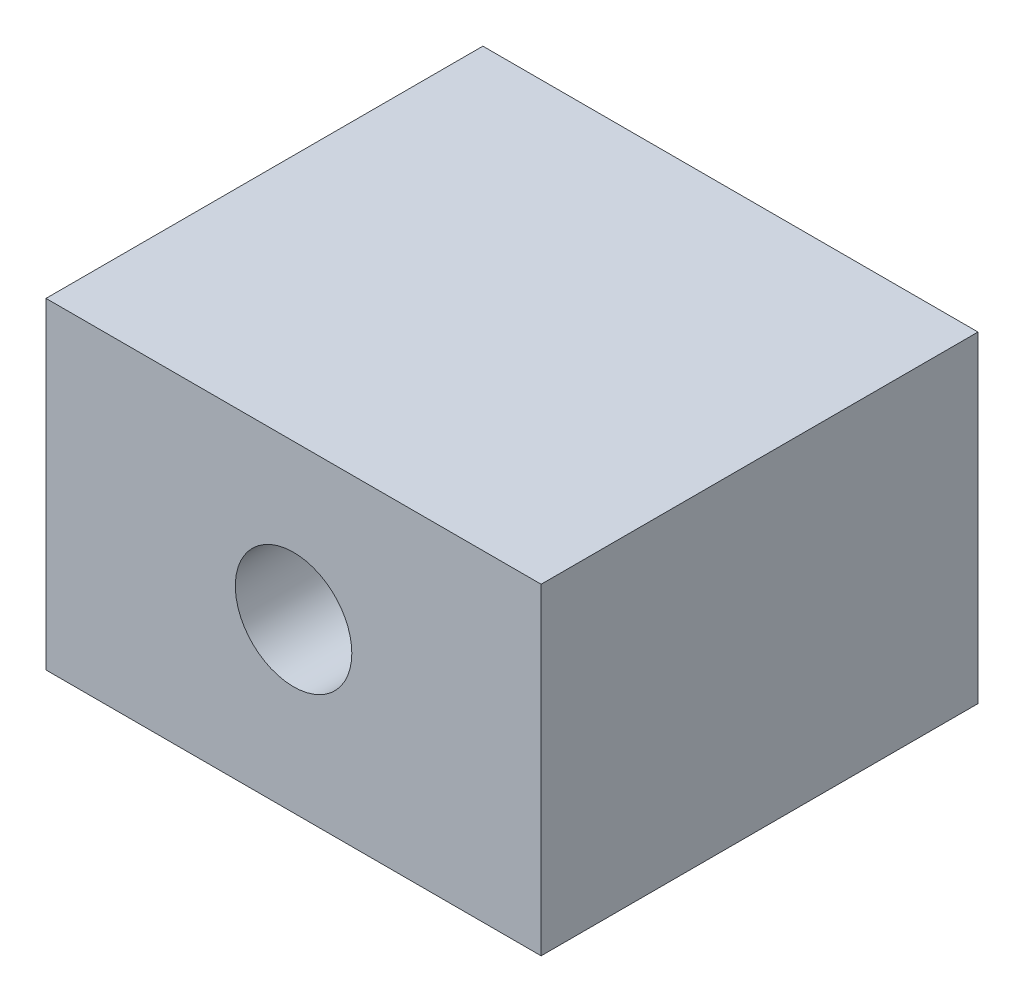
ISO-10303-21;
HEADER;
FILE_DESCRIPTION(('STEP AP214'),'2;1');
FILE_NAME('part.step','',(''),(''),'','','');
FILE_SCHEMA(('AUTOMOTIVE_DESIGN { 1 0 10303 214 1 1 1 1 }'));
ENDSEC;
DATA;
#1=APPLICATION_CONTEXT('core data for automotive mechanical design processes');
#2=APPLICATION_PROTOCOL_DEFINITION('international standard','automotive_design',2000,#1);
#3=PRODUCT_CONTEXT('',#1,'mechanical');
#4=PRODUCT('Part','Part','',(#3));
#5=PRODUCT_RELATED_PRODUCT_CATEGORY('part','',(#4));
#6=PRODUCT_DEFINITION_FORMATION('','',#4);
#7=PRODUCT_DEFINITION_CONTEXT('part definition',#1,'design');
#8=PRODUCT_DEFINITION('design','',#6,#7);
#9=PRODUCT_DEFINITION_SHAPE('','',#8);
#10=(LENGTH_UNIT() NAMED_UNIT(*) SI_UNIT(.MILLI.,.METRE.));
#11=(NAMED_UNIT(*) PLANE_ANGLE_UNIT() SI_UNIT($,.RADIAN.));
#12=(NAMED_UNIT(*) SI_UNIT($,.STERADIAN.) SOLID_ANGLE_UNIT());
#13=UNCERTAINTY_MEASURE_WITH_UNIT(LENGTH_MEASURE(1.E-05),#10,'distance_accuracy_value','');
#14=(GEOMETRIC_REPRESENTATION_CONTEXT(3) GLOBAL_UNCERTAINTY_ASSIGNED_CONTEXT((#13)) GLOBAL_UNIT_ASSIGNED_CONTEXT((#10,
#11,#12)) REPRESENTATION_CONTEXT('',''));
#15=CARTESIAN_POINT('',(0.,0.,0.));
#16=DIRECTION('',(0.,0.,1.));
#17=DIRECTION('',(1.,0.,0.));
#18=AXIS2_PLACEMENT_3D('',#15,#16,#17);
#19=CARTESIAN_POINT('',(0.,0.,30.));
#20=DIRECTION('',(0.,0.,-1.));
#21=DIRECTION('',(-1.,0.,0.));
#22=AXIS2_PLACEMENT_3D('',#19,#20,#21);
#23=PLANE('',#22);
#24=DIRECTION('',(0.,-1.,0.));
#25=VECTOR('',#24,1.);
#26=CARTESIAN_POINT('',(0.,0.,30.));
#27=LINE('',#26,#25);
#28=CARTESIAN_POINT('',(0.,22.1,30.));
#29=VERTEX_POINT('',#28);
#30=CARTESIAN_POINT('',(0.,0.,30.));
#31=VERTEX_POINT('',#30);
#32=EDGE_CURVE('E92',#29,#31,#27,.T.);
#33=ORIENTED_EDGE('',*,*,#32,.T.);
#34=DIRECTION('',(1.,0.,0.));
#35=VECTOR('',#34,1.);
#36=CARTESIAN_POINT('',(0.,0.,30.));
#37=LINE('',#36,#35);
#38=CARTESIAN_POINT('',(34.,0.,30.));
#39=VERTEX_POINT('',#38);
#40=EDGE_CURVE('E87',#31,#39,#37,.T.);
#41=ORIENTED_EDGE('',*,*,#40,.T.);
#42=DIRECTION('',(0.,1.,0.));
#43=VECTOR('',#42,1.);
#44=CARTESIAN_POINT('',(34.,0.,30.));
#45=LINE('',#44,#43);
#46=CARTESIAN_POINT('',(34.,22.1,30.));
#47=VERTEX_POINT('',#46);
#48=EDGE_CURVE('E90',#39,#47,#45,.T.);
#49=ORIENTED_EDGE('',*,*,#48,.T.);
#50=DIRECTION('',(-1.,0.,0.));
#51=VECTOR('',#50,1.);
#52=CARTESIAN_POINT('',(0.,22.1,30.));
#53=LINE('',#52,#51);
#54=EDGE_CURVE('E57',#47,#29,#53,.T.);
#55=ORIENTED_EDGE('',*,*,#54,.T.);
#56=EDGE_LOOP('',(#33,#41,#49,#55));
#57=FACE_BOUND('',#56,.T.);
#58=CARTESIAN_POINT('',(17.,11.5,30.));
#59=DIRECTION('',(0.,0.,1.));
#60=DIRECTION('',(1.,0.,0.));
#61=AXIS2_PLACEMENT_3D('',#58,#59,#60);
#62=CIRCLE('',#61,4.);
#63=CARTESIAN_POINT('',(21.,11.5,30.));
#64=VERTEX_POINT('',#63);
#65=EDGE_CURVE('E112',#64,#64,#62,.T.);
#66=ORIENTED_EDGE('',*,*,#65,.F.);
#67=EDGE_LOOP('',(#66));
#68=FACE_BOUND('',#67,.T.);
#69=ADVANCED_FACE('F39',(#57,#68),#23,.F.);
#70=CARTESIAN_POINT('',(0.,0.,0.));
#71=DIRECTION('',(0.,0.,-1.));
#72=DIRECTION('',(-1.,0.,0.));
#73=AXIS2_PLACEMENT_3D('',#70,#71,#72);
#74=PLANE('',#73);
#75=DIRECTION('',(0.,-1.,0.));
#76=VECTOR('',#75,1.);
#77=CARTESIAN_POINT('',(0.,0.,0.));
#78=LINE('',#77,#76);
#79=CARTESIAN_POINT('',(0.,22.1,0.));
#80=VERTEX_POINT('',#79);
#81=CARTESIAN_POINT('',(0.,0.,0.));
#82=VERTEX_POINT('',#81);
#83=EDGE_CURVE('E108',#80,#82,#78,.T.);
#84=ORIENTED_EDGE('',*,*,#83,.F.);
#85=DIRECTION('',(-1.,0.,0.));
#86=VECTOR('',#85,1.);
#87=CARTESIAN_POINT('',(0.,22.1,0.));
#88=LINE('',#87,#86);
#89=CARTESIAN_POINT('',(34.,22.1,0.));
#90=VERTEX_POINT('',#89);
#91=EDGE_CURVE('E80',#90,#80,#88,.T.);
#92=ORIENTED_EDGE('',*,*,#91,.F.);
#93=DIRECTION('',(0.,1.,0.));
#94=VECTOR('',#93,1.);
#95=CARTESIAN_POINT('',(34.,0.,0.));
#96=LINE('',#95,#94);
#97=CARTESIAN_POINT('',(34.,0.,0.));
#98=VERTEX_POINT('',#97);
#99=EDGE_CURVE('E74',#98,#90,#96,.T.);
#100=ORIENTED_EDGE('',*,*,#99,.F.);
#101=DIRECTION('',(1.,0.,0.));
#102=VECTOR('',#101,1.);
#103=CARTESIAN_POINT('',(0.,0.,0.));
#104=LINE('',#103,#102);
#105=EDGE_CURVE('E97',#82,#98,#104,.T.);
#106=ORIENTED_EDGE('',*,*,#105,.F.);
#107=EDGE_LOOP('',(#84,#92,#100,#106));
#108=FACE_BOUND('',#107,.T.);
#109=CARTESIAN_POINT('',(17.,11.5,0.));
#110=DIRECTION('',(0.,0.,1.));
#111=DIRECTION('',(1.,0.,0.));
#112=AXIS2_PLACEMENT_3D('',#109,#110,#111);
#113=CIRCLE('',#112,4.);
#114=CARTESIAN_POINT('',(21.,11.5,0.));
#115=VERTEX_POINT('',#114);
#116=EDGE_CURVE('E130',#115,#115,#113,.T.);
#117=ORIENTED_EDGE('',*,*,#116,.T.);
#118=EDGE_LOOP('',(#117));
#119=FACE_BOUND('',#118,.T.);
#120=ADVANCED_FACE('F125',(#108,#119),#74,.T.);
#121=CARTESIAN_POINT('',(0.,0.,30.));
#122=DIRECTION('',(1.,0.,0.));
#123=DIRECTION('',(0.,0.,-1.));
#124=AXIS2_PLACEMENT_3D('',#121,#122,#123);
#125=PLANE('',#124);
#126=ORIENTED_EDGE('',*,*,#83,.T.);
#127=DIRECTION('',(0.,0.,-1.));
#128=VECTOR('',#127,1.);
#129=CARTESIAN_POINT('',(0.,0.,30.));
#130=LINE('',#129,#128);
#131=EDGE_CURVE('E11',#31,#82,#130,.T.);
#132=ORIENTED_EDGE('',*,*,#131,.F.);
#133=ORIENTED_EDGE('',*,*,#32,.F.);
#134=DIRECTION('',(0.,0.,-1.));
#135=VECTOR('',#134,1.);
#136=CARTESIAN_POINT('',(0.,22.1,30.));
#137=LINE('',#136,#135);
#138=EDGE_CURVE('E104',#29,#80,#137,.T.);
#139=ORIENTED_EDGE('',*,*,#138,.T.);
#140=EDGE_LOOP('',(#126,#132,#133,#139));
#141=FACE_BOUND('',#140,.T.);
#142=ADVANCED_FACE('F41',(#141),#125,.F.);
#143=CARTESIAN_POINT('',(0.,0.,30.));
#144=DIRECTION('',(0.,1.,0.));
#145=DIRECTION('',(0.,0.,1.));
#146=AXIS2_PLACEMENT_3D('',#143,#144,#145);
#147=PLANE('',#146);
#148=ORIENTED_EDGE('',*,*,#105,.T.);
#149=DIRECTION('',(0.,0.,-1.));
#150=VECTOR('',#149,1.);
#151=CARTESIAN_POINT('',(34.,0.,30.));
#152=LINE('',#151,#150);
#153=EDGE_CURVE('E49',#39,#98,#152,.T.);
#154=ORIENTED_EDGE('',*,*,#153,.F.);
#155=ORIENTED_EDGE('',*,*,#40,.F.);
#156=ORIENTED_EDGE('',*,*,#131,.T.);
#157=EDGE_LOOP('',(#148,#154,#155,#156));
#158=FACE_BOUND('',#157,.T.);
#159=ADVANCED_FACE('F96',(#158),#147,.F.);
#160=CARTESIAN_POINT('',(34.,0.,30.));
#161=DIRECTION('',(-1.,0.,0.));
#162=DIRECTION('',(0.,0.,1.));
#163=AXIS2_PLACEMENT_3D('',#160,#161,#162);
#164=PLANE('',#163);
#165=ORIENTED_EDGE('',*,*,#99,.T.);
#166=DIRECTION('',(0.,0.,-1.));
#167=VECTOR('',#166,1.);
#168=CARTESIAN_POINT('',(34.,22.1,30.));
#169=LINE('',#168,#167);
#170=EDGE_CURVE('E99',#47,#90,#169,.T.);
#171=ORIENTED_EDGE('',*,*,#170,.F.);
#172=ORIENTED_EDGE('',*,*,#48,.F.);
#173=ORIENTED_EDGE('',*,*,#153,.T.);
#174=EDGE_LOOP('',(#165,#171,#172,#173));
#175=FACE_BOUND('',#174,.T.);
#176=ADVANCED_FACE('F100',(#175),#164,.F.);
#177=CARTESIAN_POINT('',(0.,22.1,30.));
#178=DIRECTION('',(0.,-1.,0.));
#179=DIRECTION('',(0.,0.,-1.));
#180=AXIS2_PLACEMENT_3D('',#177,#178,#179);
#181=PLANE('',#180);
#182=ORIENTED_EDGE('',*,*,#91,.T.);
#183=ORIENTED_EDGE('',*,*,#138,.F.);
#184=ORIENTED_EDGE('',*,*,#54,.F.);
#185=ORIENTED_EDGE('',*,*,#170,.T.);
#186=EDGE_LOOP('',(#182,#183,#184,#185));
#187=FACE_BOUND('',#186,.T.);
#188=ADVANCED_FACE('F122',(#187),#181,.F.);
#189=CARTESIAN_POINT('',(17.,11.5,30.));
#190=DIRECTION('',(0.,0.,-1.));
#191=DIRECTION('',(-1.,0.,0.));
#192=AXIS2_PLACEMENT_3D('',#189,#190,#191);
#193=CYLINDRICAL_SURFACE('',#192,4.);
#194=ORIENTED_EDGE('',*,*,#65,.T.);
#195=EDGE_LOOP('',(#194));
#196=FACE_BOUND('',#195,.T.);
#197=ORIENTED_EDGE('',*,*,#116,.F.);
#198=EDGE_LOOP('',(#197));
#199=FACE_BOUND('',#198,.T.);
#200=ADVANCED_FACE('F138',(#196,#199),#193,.F.);
#201=CLOSED_SHELL('',(#69,#120,#142,#159,#176,#188,#200));
#202=MANIFOLD_SOLID_BREP('B2',#201);
#203=ADVANCED_BREP_SHAPE_REPRESENTATION('',(#18,#202),#14);
#204=SHAPE_DEFINITION_REPRESENTATION(#9,#203);
ENDSEC;
END-ISO-10303-21;
